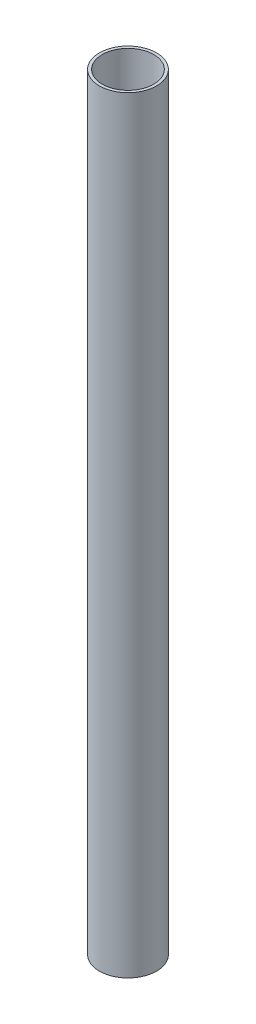
ISO-10303-21;
HEADER;
FILE_DESCRIPTION(('STEP AP214'),'2;1');
FILE_NAME('part.step','',(''),(''),'','','');
FILE_SCHEMA(('AUTOMOTIVE_DESIGN { 1 0 10303 214 1 1 1 1 }'));
ENDSEC;
DATA;
#1=APPLICATION_CONTEXT('core data for automotive mechanical design processes');
#2=APPLICATION_PROTOCOL_DEFINITION('international standard','automotive_design',2000,#1);
#3=PRODUCT_CONTEXT('',#1,'mechanical');
#4=PRODUCT('Part','Part','',(#3));
#5=PRODUCT_RELATED_PRODUCT_CATEGORY('part','',(#4));
#6=PRODUCT_DEFINITION_FORMATION('','',#4);
#7=PRODUCT_DEFINITION_CONTEXT('part definition',#1,'design');
#8=PRODUCT_DEFINITION('design','',#6,#7);
#9=PRODUCT_DEFINITION_SHAPE('','',#8);
#10=(LENGTH_UNIT() NAMED_UNIT(*) SI_UNIT(.MILLI.,.METRE.));
#11=(NAMED_UNIT(*) PLANE_ANGLE_UNIT() SI_UNIT($,.RADIAN.));
#12=(NAMED_UNIT(*) SI_UNIT($,.STERADIAN.) SOLID_ANGLE_UNIT());
#13=UNCERTAINTY_MEASURE_WITH_UNIT(LENGTH_MEASURE(1.E-05),#10,'distance_accuracy_value','');
#14=(GEOMETRIC_REPRESENTATION_CONTEXT(3) GLOBAL_UNCERTAINTY_ASSIGNED_CONTEXT((#13)) GLOBAL_UNIT_ASSIGNED_CONTEXT((#10,
#11,#12)) REPRESENTATION_CONTEXT('',''));
#15=CARTESIAN_POINT('',(0.,0.,0.));
#16=DIRECTION('',(0.,0.,1.));
#17=DIRECTION('',(1.,0.,0.));
#18=AXIS2_PLACEMENT_3D('',#15,#16,#17);
#19=CARTESIAN_POINT('',(0.,268.,0.));
#20=DIRECTION('',(0.,1.,0.));
#21=DIRECTION('',(0.,0.,1.));
#22=AXIS2_PLACEMENT_3D('',#19,#20,#21);
#23=PLANE('',#22);
#24=CARTESIAN_POINT('',(0.,268.,0.));
#25=DIRECTION('',(0.,1.,0.));
#26=DIRECTION('',(0.,0.,1.));
#27=AXIS2_PLACEMENT_3D('',#24,#25,#26);
#28=CIRCLE('',#27,10.);
#29=CARTESIAN_POINT('',(0.,268.,10.));
#30=VERTEX_POINT('',#29);
#31=EDGE_CURVE('E10',#30,#30,#28,.T.);
#32=ORIENTED_EDGE('',*,*,#31,.T.);
#33=EDGE_LOOP('',(#32));
#34=FACE_BOUND('',#33,.T.);
#35=CARTESIAN_POINT('',(0.,268.,0.));
#36=DIRECTION('',(0.,1.,0.));
#37=DIRECTION('',(0.,0.,1.));
#38=AXIS2_PLACEMENT_3D('',#35,#36,#37);
#39=CIRCLE('',#38,9.);
#40=CARTESIAN_POINT('',(0.,268.,9.));
#41=VERTEX_POINT('',#40);
#42=EDGE_CURVE('E52',#41,#41,#39,.T.);
#43=ORIENTED_EDGE('',*,*,#42,.F.);
#44=EDGE_LOOP('',(#43));
#45=FACE_BOUND('',#44,.T.);
#46=ADVANCED_FACE('F39',(#34,#45),#23,.T.);
#47=CARTESIAN_POINT('',(0.,0.,0.));
#48=DIRECTION('',(0.,1.,0.));
#49=DIRECTION('',(0.,0.,1.));
#50=AXIS2_PLACEMENT_3D('',#47,#48,#49);
#51=PLANE('',#50);
#52=CARTESIAN_POINT('',(0.,0.,0.));
#53=DIRECTION('',(0.,1.,0.));
#54=DIRECTION('',(0.,0.,1.));
#55=AXIS2_PLACEMENT_3D('',#52,#53,#54);
#56=CIRCLE('',#55,10.);
#57=CARTESIAN_POINT('',(0.,0.,10.));
#58=VERTEX_POINT('',#57);
#59=EDGE_CURVE('E43',#58,#58,#56,.T.);
#60=ORIENTED_EDGE('',*,*,#59,.F.);
#61=EDGE_LOOP('',(#60));
#62=FACE_BOUND('',#61,.T.);
#63=CARTESIAN_POINT('',(0.,0.,0.));
#64=DIRECTION('',(0.,1.,0.));
#65=DIRECTION('',(0.,0.,1.));
#66=AXIS2_PLACEMENT_3D('',#63,#64,#65);
#67=CIRCLE('',#66,9.);
#68=CARTESIAN_POINT('',(0.,0.,9.));
#69=VERTEX_POINT('',#68);
#70=EDGE_CURVE('E54',#69,#69,#67,.T.);
#71=ORIENTED_EDGE('',*,*,#70,.T.);
#72=EDGE_LOOP('',(#71));
#73=FACE_BOUND('',#72,.T.);
#74=ADVANCED_FACE('F66',(#62,#73),#51,.F.);
#75=CARTESIAN_POINT('',(0.,268.,0.));
#76=DIRECTION('',(0.,-1.,0.));
#77=DIRECTION('',(0.,0.,-1.));
#78=AXIS2_PLACEMENT_3D('',#75,#76,#77);
#79=CYLINDRICAL_SURFACE('',#78,10.);
#80=ORIENTED_EDGE('',*,*,#31,.F.);
#81=EDGE_LOOP('',(#80));
#82=FACE_BOUND('',#81,.T.);
#83=ORIENTED_EDGE('',*,*,#59,.T.);
#84=EDGE_LOOP('',(#83));
#85=FACE_BOUND('',#84,.T.);
#86=ADVANCED_FACE('F41',(#82,#85),#79,.T.);
#87=CARTESIAN_POINT('',(0.,268.,0.));
#88=DIRECTION('',(0.,-1.,0.));
#89=DIRECTION('',(0.,0.,-1.));
#90=AXIS2_PLACEMENT_3D('',#87,#88,#89);
#91=CYLINDRICAL_SURFACE('',#90,9.);
#92=ORIENTED_EDGE('',*,*,#42,.T.);
#93=EDGE_LOOP('',(#92));
#94=FACE_BOUND('',#93,.T.);
#95=ORIENTED_EDGE('',*,*,#70,.F.);
#96=EDGE_LOOP('',(#95));
#97=FACE_BOUND('',#96,.T.);
#98=ADVANCED_FACE('F62',(#94,#97),#91,.F.);
#99=CLOSED_SHELL('',(#46,#74,#86,#98));
#100=MANIFOLD_SOLID_BREP('B2',#99);
#101=ADVANCED_BREP_SHAPE_REPRESENTATION('',(#18,#100),#14);
#102=SHAPE_DEFINITION_REPRESENTATION(#9,#101);
ENDSEC;
END-ISO-10303-21;
